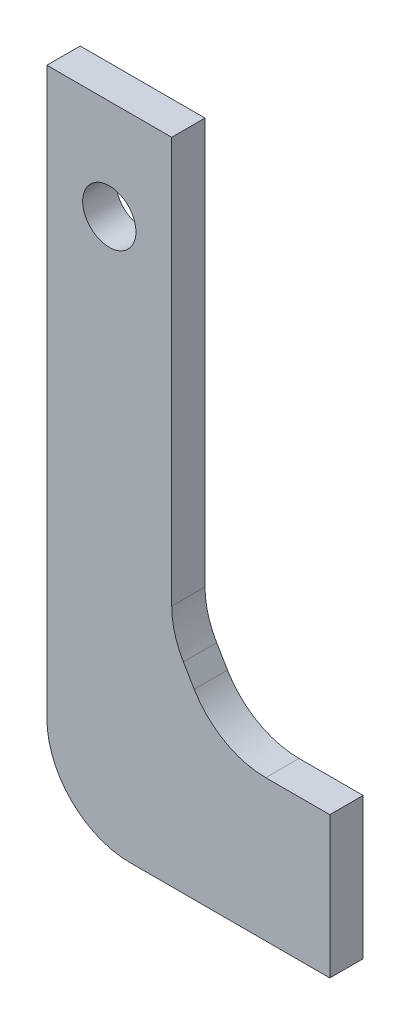
ISO-10303-21;
HEADER;
FILE_DESCRIPTION(('STEP AP214'),'2;1');
FILE_NAME('part.step','',(''),(''),'','','');
FILE_SCHEMA(('AUTOMOTIVE_DESIGN { 1 0 10303 214 1 1 1 1 }'));
ENDSEC;
DATA;
#1=APPLICATION_CONTEXT('core data for automotive mechanical design processes');
#2=APPLICATION_PROTOCOL_DEFINITION('international standard','automotive_design',2000,#1);
#3=PRODUCT_CONTEXT('',#1,'mechanical');
#4=PRODUCT('Part','Part','',(#3));
#5=PRODUCT_RELATED_PRODUCT_CATEGORY('part','',(#4));
#6=PRODUCT_DEFINITION_FORMATION('','',#4);
#7=PRODUCT_DEFINITION_CONTEXT('part definition',#1,'design');
#8=PRODUCT_DEFINITION('design','',#6,#7);
#9=PRODUCT_DEFINITION_SHAPE('','',#8);
#10=(LENGTH_UNIT() NAMED_UNIT(*) SI_UNIT(.MILLI.,.METRE.));
#11=(NAMED_UNIT(*) PLANE_ANGLE_UNIT() SI_UNIT($,.RADIAN.));
#12=(NAMED_UNIT(*) SI_UNIT($,.STERADIAN.) SOLID_ANGLE_UNIT());
#13=UNCERTAINTY_MEASURE_WITH_UNIT(LENGTH_MEASURE(1.E-05),#10,'distance_accuracy_value','');
#14=(GEOMETRIC_REPRESENTATION_CONTEXT(3) GLOBAL_UNCERTAINTY_ASSIGNED_CONTEXT((#13)) GLOBAL_UNIT_ASSIGNED_CONTEXT((#10,
#11,#12)) REPRESENTATION_CONTEXT('',''));
#15=CARTESIAN_POINT('',(0.,0.,0.));
#16=DIRECTION('',(0.,0.,1.));
#17=DIRECTION('',(1.,0.,0.));
#18=AXIS2_PLACEMENT_3D('',#15,#16,#17);
#19=CARTESIAN_POINT('',(-9.94142259414227,5.60827662797224,2.));
#20=DIRECTION('',(0.,0.,-1.));
#21=DIRECTION('',(-1.,0.,0.));
#22=AXIS2_PLACEMENT_3D('',#19,#20,#21);
#23=PLANE('',#22);
#24=DIRECTION('',(1.,0.,0.));
#25=VECTOR('',#24,1.);
#26=CARTESIAN_POINT('',(-22.4414225941423,30.0062761506276,2.));
#27=LINE('',#26,#25);
#28=CARTESIAN_POINT('',(-22.4414225941423,30.0062761506276,2.));
#29=VERTEX_POINT('',#28);
#30=CARTESIAN_POINT('',(-14.9414225941423,30.0062761506276,2.));
#31=VERTEX_POINT('',#30);
#32=EDGE_CURVE('E204',#29,#31,#27,.T.);
#33=ORIENTED_EDGE('',*,*,#32,.F.);
#34=DIRECTION('',(0.,-1.,0.));
#35=VECTOR('',#34,1.);
#36=CARTESIAN_POINT('',(-22.4414225941423,30.0062761506276,2.));
#37=LINE('',#36,#35);
#38=CARTESIAN_POINT('',(-22.4414225941423,-3.99372384937234,2.));
#39=VERTEX_POINT('',#38);
#40=EDGE_CURVE('E158',#29,#39,#37,.T.);
#41=ORIENTED_EDGE('',*,*,#40,.T.);
#42=CARTESIAN_POINT('',(-17.4414225941423,-3.99372384937238,2.));
#43=DIRECTION('',(0.,0.,1.));
#44=DIRECTION('',(1.,0.,0.));
#45=AXIS2_PLACEMENT_3D('',#42,#43,#44);
#46=CIRCLE('',#45,5.);
#47=CARTESIAN_POINT('',(-17.4414225941422,-8.99372384937238,2.));
#48=VERTEX_POINT('',#47);
#49=EDGE_CURVE('E151',#39,#48,#46,.T.);
#50=ORIENTED_EDGE('',*,*,#49,.T.);
#51=DIRECTION('',(1.,0.,0.));
#52=VECTOR('',#51,1.);
#53=CARTESIAN_POINT('',(-17.4414225941422,-8.99372384937238,2.));
#54=LINE('',#53,#52);
#55=CARTESIAN_POINT('',(-5.44142259414226,-8.99372384937238,2.));
#56=VERTEX_POINT('',#55);
#57=EDGE_CURVE('E156',#48,#56,#54,.T.);
#58=ORIENTED_EDGE('',*,*,#57,.T.);
#59=DIRECTION('',(0.,1.,0.));
#60=VECTOR('',#59,1.);
#61=CARTESIAN_POINT('',(-5.44142259414226,-8.99372384937238,2.));
#62=LINE('',#61,#60);
#63=CARTESIAN_POINT('',(-5.44142259414226,-0.493723849372379,2.));
#64=VERTEX_POINT('',#63);
#65=EDGE_CURVE('E173',#56,#64,#62,.T.);
#66=ORIENTED_EDGE('',*,*,#65,.T.);
#67=DIRECTION('',(1.,0.,0.));
#68=VECTOR('',#67,1.);
#69=CARTESIAN_POINT('',(-9.28759971678885,-0.493723849372379,2.));
#70=LINE('',#69,#68);
#71=CARTESIAN_POINT('',(-9.28759971678885,-0.49372384937238,2.));
#72=VERTEX_POINT('',#71);
#73=EDGE_CURVE('E175',#72,#64,#70,.T.);
#74=ORIENTED_EDGE('',*,*,#73,.F.);
#75=CARTESIAN_POINT('',(-9.28759971678885,4.50627615062762,2.));
#76=DIRECTION('',(0.,0.,1.));
#77=DIRECTION('',(1.,0.,0.));
#78=AXIS2_PLACEMENT_3D('',#75,#76,#77);
#79=CIRCLE('',#78,5.);
#80=CARTESIAN_POINT('',(-13.5877124021307,1.95499590468004,2.));
#81=VERTEX_POINT('',#80);
#82=EDGE_CURVE('E231',#81,#72,#79,.T.);
#83=ORIENTED_EDGE('',*,*,#82,.F.);
#84=DIRECTION('',(-0.510256049189516,0.860022537068364,0.));
#85=VECTOR('',#84,1.);
#86=CARTESIAN_POINT('',(-13.5877124021307,1.95499590468004,2.));
#87=LINE('',#86,#85);
#88=CARTESIAN_POINT('',(-14.2415352794841,3.05699638202466,2.));
#89=VERTEX_POINT('',#88);
#90=EDGE_CURVE('E238',#81,#89,#87,.T.);
#91=ORIENTED_EDGE('',*,*,#90,.T.);
#92=CARTESIAN_POINT('',(-9.94142259414227,5.60827662797224,2.));
#93=DIRECTION('',(0.,0.,-1.));
#94=DIRECTION('',(-1.,0.,0.));
#95=AXIS2_PLACEMENT_3D('',#92,#93,#94);
#96=CIRCLE('',#95,5.);
#97=CARTESIAN_POINT('',(-14.9414225941423,5.60827662797224,2.));
#98=VERTEX_POINT('',#97);
#99=EDGE_CURVE('E240',#89,#98,#96,.T.);
#100=ORIENTED_EDGE('',*,*,#99,.T.);
#101=DIRECTION('',(0.,-1.,0.));
#102=VECTOR('',#101,1.);
#103=CARTESIAN_POINT('',(-14.9414225941423,30.0062761506276,2.));
#104=LINE('',#103,#102);
#105=EDGE_CURVE('E244',#31,#98,#104,.T.);
#106=ORIENTED_EDGE('',*,*,#105,.F.);
#107=EDGE_LOOP('',(#33,#41,#50,#58,#66,#74,#83,#91,#100,#106));
#108=FACE_BOUND('',#107,.T.);
#109=CARTESIAN_POINT('',(-18.6914225941423,24.0062761506276,2.));
#110=DIRECTION('',(0.,0.,1.));
#111=DIRECTION('',(1.,0.,0.));
#112=AXIS2_PLACEMENT_3D('',#109,#110,#111);
#113=CIRCLE('',#112,1.6);
#114=CARTESIAN_POINT('',(-17.0914225941423,24.0062761506276,2.));
#115=VERTEX_POINT('',#114);
#116=EDGE_CURVE('E184',#115,#115,#113,.T.);
#117=ORIENTED_EDGE('',*,*,#116,.F.);
#118=EDGE_LOOP('',(#117));
#119=FACE_BOUND('',#118,.T.);
#120=ADVANCED_FACE('F69',(#108,#119),#23,.F.);
#121=CARTESIAN_POINT('',(-9.94142259414227,5.60827662797224,0.));
#122=DIRECTION('',(0.,0.,-1.));
#123=DIRECTION('',(-1.,0.,0.));
#124=AXIS2_PLACEMENT_3D('',#121,#122,#123);
#125=PLANE('',#124);
#126=DIRECTION('',(1.,0.,0.));
#127=VECTOR('',#126,1.);
#128=CARTESIAN_POINT('',(-22.4414225941423,30.0062761506276,0.));
#129=LINE('',#128,#127);
#130=CARTESIAN_POINT('',(-22.4414225941423,30.0062761506276,0.));
#131=VERTEX_POINT('',#130);
#132=CARTESIAN_POINT('',(-14.9414225941423,30.0062761506276,0.));
#133=VERTEX_POINT('',#132);
#134=EDGE_CURVE('E180',#131,#133,#129,.T.);
#135=ORIENTED_EDGE('',*,*,#134,.T.);
#136=DIRECTION('',(0.,-1.,0.));
#137=VECTOR('',#136,1.);
#138=CARTESIAN_POINT('',(-14.9414225941423,30.0062761506276,0.));
#139=LINE('',#138,#137);
#140=CARTESIAN_POINT('',(-14.9414225941423,5.60827662797224,0.));
#141=VERTEX_POINT('',#140);
#142=EDGE_CURVE('E183',#133,#141,#139,.T.);
#143=ORIENTED_EDGE('',*,*,#142,.T.);
#144=CARTESIAN_POINT('',(-9.94142259414227,5.60827662797224,0.));
#145=DIRECTION('',(0.,0.,-1.));
#146=DIRECTION('',(-1.,0.,0.));
#147=AXIS2_PLACEMENT_3D('',#144,#145,#146);
#148=CIRCLE('',#147,5.);
#149=CARTESIAN_POINT('',(-14.2415352794841,3.05699638202466,0.));
#150=VERTEX_POINT('',#149);
#151=EDGE_CURVE('E187',#150,#141,#148,.T.);
#152=ORIENTED_EDGE('',*,*,#151,.F.);
#153=DIRECTION('',(-0.510256049189516,0.860022537068364,0.));
#154=VECTOR('',#153,1.);
#155=CARTESIAN_POINT('',(-13.5877124021307,1.95499590468004,0.));
#156=LINE('',#155,#154);
#157=CARTESIAN_POINT('',(-13.5877124021307,1.95499590468004,0.));
#158=VERTEX_POINT('',#157);
#159=EDGE_CURVE('E190',#158,#150,#156,.T.);
#160=ORIENTED_EDGE('',*,*,#159,.F.);
#161=CARTESIAN_POINT('',(-9.28759971678885,4.50627615062762,0.));
#162=DIRECTION('',(0.,0.,1.));
#163=DIRECTION('',(1.,0.,0.));
#164=AXIS2_PLACEMENT_3D('',#161,#162,#163);
#165=CIRCLE('',#164,5.);
#166=CARTESIAN_POINT('',(-9.28759971678885,-0.49372384937238,0.));
#167=VERTEX_POINT('',#166);
#168=EDGE_CURVE('E192',#158,#167,#165,.T.);
#169=ORIENTED_EDGE('',*,*,#168,.T.);
#170=DIRECTION('',(1.,0.,0.));
#171=VECTOR('',#170,1.);
#172=CARTESIAN_POINT('',(-9.28759971678885,-0.493723849372379,0.));
#173=LINE('',#172,#171);
#174=CARTESIAN_POINT('',(-5.44142259414226,-0.493723849372379,0.));
#175=VERTEX_POINT('',#174);
#176=EDGE_CURVE('E195',#167,#175,#173,.T.);
#177=ORIENTED_EDGE('',*,*,#176,.T.);
#178=DIRECTION('',(0.,1.,0.));
#179=VECTOR('',#178,1.);
#180=CARTESIAN_POINT('',(-5.44142259414226,-8.99372384937238,0.));
#181=LINE('',#180,#179);
#182=CARTESIAN_POINT('',(-5.44142259414226,-8.99372384937238,0.));
#183=VERTEX_POINT('',#182);
#184=EDGE_CURVE('E198',#183,#175,#181,.T.);
#185=ORIENTED_EDGE('',*,*,#184,.F.);
#186=DIRECTION('',(1.,0.,0.));
#187=VECTOR('',#186,1.);
#188=CARTESIAN_POINT('',(-17.4414225941422,-8.99372384937238,0.));
#189=LINE('',#188,#187);
#190=CARTESIAN_POINT('',(-17.4414225941422,-8.99372384937238,0.));
#191=VERTEX_POINT('',#190);
#192=EDGE_CURVE('E201',#191,#183,#189,.T.);
#193=ORIENTED_EDGE('',*,*,#192,.F.);
#194=CARTESIAN_POINT('',(-17.4414225941423,-3.99372384937238,0.));
#195=DIRECTION('',(0.,0.,1.));
#196=DIRECTION('',(1.,0.,0.));
#197=AXIS2_PLACEMENT_3D('',#194,#195,#196);
#198=CIRCLE('',#197,5.);
#199=CARTESIAN_POINT('',(-22.4414225941423,-3.99372384937234,0.));
#200=VERTEX_POINT('',#199);
#201=EDGE_CURVE('E165',#200,#191,#198,.T.);
#202=ORIENTED_EDGE('',*,*,#201,.F.);
#203=DIRECTION('',(0.,-1.,0.));
#204=VECTOR('',#203,1.);
#205=CARTESIAN_POINT('',(-22.4414225941423,30.0062761506276,0.));
#206=LINE('',#205,#204);
#207=EDGE_CURVE('E121',#131,#200,#206,.T.);
#208=ORIENTED_EDGE('',*,*,#207,.F.);
#209=EDGE_LOOP('',(#135,#143,#152,#160,#169,#177,#185,#193,#202,#208));
#210=FACE_BOUND('',#209,.T.);
#211=CARTESIAN_POINT('',(-18.6914225941423,24.0062761506276,0.));
#212=DIRECTION('',(0.,0.,1.));
#213=DIRECTION('',(1.,0.,0.));
#214=AXIS2_PLACEMENT_3D('',#211,#212,#213);
#215=CIRCLE('',#214,1.6);
#216=CARTESIAN_POINT('',(-17.0914225941423,24.0062761506276,0.));
#217=VERTEX_POINT('',#216);
#218=EDGE_CURVE('E247',#217,#217,#215,.T.);
#219=ORIENTED_EDGE('',*,*,#218,.T.);
#220=EDGE_LOOP('',(#219));
#221=FACE_BOUND('',#220,.T.);
#222=ADVANCED_FACE('F221',(#210,#221),#125,.T.);
#223=CARTESIAN_POINT('',(-22.4414225941423,30.0062761506276,2.));
#224=DIRECTION('',(0.,1.,0.));
#225=DIRECTION('',(0.,0.,1.));
#226=AXIS2_PLACEMENT_3D('',#223,#224,#225);
#227=PLANE('',#226);
#228=ORIENTED_EDGE('',*,*,#134,.F.);
#229=DIRECTION('',(0.,0.,-1.));
#230=VECTOR('',#229,1.);
#231=CARTESIAN_POINT('',(-22.4414225941423,30.0062761506276,2.));
#232=LINE('',#231,#230);
#233=EDGE_CURVE('E12',#29,#131,#232,.T.);
#234=ORIENTED_EDGE('',*,*,#233,.F.);
#235=ORIENTED_EDGE('',*,*,#32,.T.);
#236=DIRECTION('',(0.,0.,-1.));
#237=VECTOR('',#236,1.);
#238=CARTESIAN_POINT('',(-14.9414225941423,30.0062761506276,2.));
#239=LINE('',#238,#237);
#240=EDGE_CURVE('E73',#31,#133,#239,.T.);
#241=ORIENTED_EDGE('',*,*,#240,.T.);
#242=EDGE_LOOP('',(#228,#234,#235,#241));
#243=FACE_BOUND('',#242,.T.);
#244=ADVANCED_FACE('F71',(#243),#227,.T.);
#245=CARTESIAN_POINT('',(-22.4414225941423,30.0062761506276,2.));
#246=DIRECTION('',(1.,0.,0.));
#247=DIRECTION('',(0.,0.,-1.));
#248=AXIS2_PLACEMENT_3D('',#245,#246,#247);
#249=PLANE('',#248);
#250=ORIENTED_EDGE('',*,*,#207,.T.);
#251=DIRECTION('',(0.,0.,-1.));
#252=VECTOR('',#251,1.);
#253=CARTESIAN_POINT('',(-22.4414225941423,-3.99372384937234,2.));
#254=LINE('',#253,#252);
#255=EDGE_CURVE('E79',#39,#200,#254,.T.);
#256=ORIENTED_EDGE('',*,*,#255,.F.);
#257=ORIENTED_EDGE('',*,*,#40,.F.);
#258=ORIENTED_EDGE('',*,*,#233,.T.);
#259=EDGE_LOOP('',(#250,#256,#257,#258));
#260=FACE_BOUND('',#259,.T.);
#261=ADVANCED_FACE('F263',(#260),#249,.F.);
#262=CARTESIAN_POINT('',(-17.4414225941423,-3.99372384937238,2.));
#263=DIRECTION('',(0.,0.,-1.));
#264=DIRECTION('',(-1.,0.,0.));
#265=AXIS2_PLACEMENT_3D('',#262,#263,#264);
#266=CYLINDRICAL_SURFACE('',#265,5.);
#267=ORIENTED_EDGE('',*,*,#201,.T.);
#268=DIRECTION('',(0.,0.,-1.));
#269=VECTOR('',#268,1.);
#270=CARTESIAN_POINT('',(-17.4414225941422,-8.99372384937238,2.));
#271=LINE('',#270,#269);
#272=EDGE_CURVE('E162',#48,#191,#271,.T.);
#273=ORIENTED_EDGE('',*,*,#272,.F.);
#274=ORIENTED_EDGE('',*,*,#49,.F.);
#275=ORIENTED_EDGE('',*,*,#255,.T.);
#276=EDGE_LOOP('',(#267,#273,#274,#275));
#277=FACE_BOUND('',#276,.T.);
#278=ADVANCED_FACE('F163',(#277),#266,.T.);
#279=CARTESIAN_POINT('',(-17.4414225941422,-8.99372384937238,2.));
#280=DIRECTION('',(0.,1.,0.));
#281=DIRECTION('',(-1.,0.,0.));
#282=AXIS2_PLACEMENT_3D('',#279,#280,#281);
#283=PLANE('',#282);
#284=ORIENTED_EDGE('',*,*,#192,.T.);
#285=DIRECTION('',(0.,0.,-1.));
#286=VECTOR('',#285,1.);
#287=CARTESIAN_POINT('',(-5.44142259414226,-8.99372384937238,2.));
#288=LINE('',#287,#286);
#289=EDGE_CURVE('E168',#56,#183,#288,.T.);
#290=ORIENTED_EDGE('',*,*,#289,.F.);
#291=ORIENTED_EDGE('',*,*,#57,.F.);
#292=ORIENTED_EDGE('',*,*,#272,.T.);
#293=EDGE_LOOP('',(#284,#290,#291,#292));
#294=FACE_BOUND('',#293,.T.);
#295=ADVANCED_FACE('F170',(#294),#283,.F.);
#296=CARTESIAN_POINT('',(-5.44142259414226,-8.99372384937238,2.));
#297=DIRECTION('',(-1.,0.,0.));
#298=DIRECTION('',(0.,-1.,0.));
#299=AXIS2_PLACEMENT_3D('',#296,#297,#298);
#300=PLANE('',#299);
#301=ORIENTED_EDGE('',*,*,#184,.T.);
#302=DIRECTION('',(0.,0.,-1.));
#303=VECTOR('',#302,1.);
#304=CARTESIAN_POINT('',(-5.44142259414226,-0.493723849372379,2.));
#305=LINE('',#304,#303);
#306=EDGE_CURVE('E208',#64,#175,#305,.T.);
#307=ORIENTED_EDGE('',*,*,#306,.F.);
#308=ORIENTED_EDGE('',*,*,#65,.F.);
#309=ORIENTED_EDGE('',*,*,#289,.T.);
#310=EDGE_LOOP('',(#301,#307,#308,#309));
#311=FACE_BOUND('',#310,.T.);
#312=ADVANCED_FACE('F225',(#311),#300,.F.);
#313=CARTESIAN_POINT('',(-9.28759971678885,-0.493723849372379,2.));
#314=DIRECTION('',(0.,1.,0.));
#315=DIRECTION('',(0.,0.,1.));
#316=AXIS2_PLACEMENT_3D('',#313,#314,#315);
#317=PLANE('',#316);
#318=ORIENTED_EDGE('',*,*,#176,.F.);
#319=DIRECTION('',(0.,0.,-1.));
#320=VECTOR('',#319,1.);
#321=CARTESIAN_POINT('',(-9.28759971678885,-0.49372384937238,2.));
#322=LINE('',#321,#320);
#323=EDGE_CURVE('E210',#72,#167,#322,.T.);
#324=ORIENTED_EDGE('',*,*,#323,.F.);
#325=ORIENTED_EDGE('',*,*,#73,.T.);
#326=ORIENTED_EDGE('',*,*,#306,.T.);
#327=EDGE_LOOP('',(#318,#324,#325,#326));
#328=FACE_BOUND('',#327,.T.);
#329=ADVANCED_FACE('F272',(#328),#317,.T.);
#330=CARTESIAN_POINT('',(-9.28759971678885,4.50627615062762,2.));
#331=DIRECTION('',(0.,0.,-1.));
#332=DIRECTION('',(-1.,0.,0.));
#333=AXIS2_PLACEMENT_3D('',#330,#331,#332);
#334=CYLINDRICAL_SURFACE('',#333,5.);
#335=ORIENTED_EDGE('',*,*,#168,.F.);
#336=DIRECTION('',(0.,0.,-1.));
#337=VECTOR('',#336,1.);
#338=CARTESIAN_POINT('',(-13.5877124021307,1.95499590468004,2.));
#339=LINE('',#338,#337);
#340=EDGE_CURVE('E212',#81,#158,#339,.T.);
#341=ORIENTED_EDGE('',*,*,#340,.F.);
#342=ORIENTED_EDGE('',*,*,#82,.T.);
#343=ORIENTED_EDGE('',*,*,#323,.T.);
#344=EDGE_LOOP('',(#335,#341,#342,#343));
#345=FACE_BOUND('',#344,.T.);
#346=ADVANCED_FACE('F235',(#345),#334,.F.);
#347=CARTESIAN_POINT('',(-13.5877124021307,1.95499590468004,2.));
#348=DIRECTION('',(-0.860022537068365,-0.510256049189516,0.));
#349=DIRECTION('',(0.510256049189516,-0.860022537068365,0.));
#350=AXIS2_PLACEMENT_3D('',#347,#348,#349);
#351=PLANE('',#350);
#352=ORIENTED_EDGE('',*,*,#159,.T.);
#353=DIRECTION('',(0.,0.,-1.));
#354=VECTOR('',#353,1.);
#355=CARTESIAN_POINT('',(-14.2415352794841,3.05699638202466,2.));
#356=LINE('',#355,#354);
#357=EDGE_CURVE('E214',#89,#150,#356,.T.);
#358=ORIENTED_EDGE('',*,*,#357,.F.);
#359=ORIENTED_EDGE('',*,*,#90,.F.);
#360=ORIENTED_EDGE('',*,*,#340,.T.);
#361=EDGE_LOOP('',(#352,#358,#359,#360));
#362=FACE_BOUND('',#361,.T.);
#363=ADVANCED_FACE('F277',(#362),#351,.F.);
#364=CARTESIAN_POINT('',(-9.94142259414227,5.60827662797224,2.));
#365=DIRECTION('',(0.,0.,-1.));
#366=DIRECTION('',(-1.,0.,0.));
#367=AXIS2_PLACEMENT_3D('',#364,#365,#366);
#368=CYLINDRICAL_SURFACE('',#367,5.);
#369=ORIENTED_EDGE('',*,*,#151,.T.);
#370=DIRECTION('',(0.,0.,-1.));
#371=VECTOR('',#370,1.);
#372=CARTESIAN_POINT('',(-14.9414225941423,5.60827662797224,2.));
#373=LINE('',#372,#371);
#374=EDGE_CURVE('E216',#98,#141,#373,.T.);
#375=ORIENTED_EDGE('',*,*,#374,.F.);
#376=ORIENTED_EDGE('',*,*,#99,.F.);
#377=ORIENTED_EDGE('',*,*,#357,.T.);
#378=EDGE_LOOP('',(#369,#375,#376,#377));
#379=FACE_BOUND('',#378,.T.);
#380=ADVANCED_FACE('F280',(#379),#368,.F.);
#381=CARTESIAN_POINT('',(-14.9414225941423,30.0062761506276,2.));
#382=DIRECTION('',(1.,0.,0.));
#383=DIRECTION('',(0.,0.,-1.));
#384=AXIS2_PLACEMENT_3D('',#381,#382,#383);
#385=PLANE('',#384);
#386=ORIENTED_EDGE('',*,*,#142,.F.);
#387=ORIENTED_EDGE('',*,*,#240,.F.);
#388=ORIENTED_EDGE('',*,*,#105,.T.);
#389=ORIENTED_EDGE('',*,*,#374,.T.);
#390=EDGE_LOOP('',(#386,#387,#388,#389));
#391=FACE_BOUND('',#390,.T.);
#392=ADVANCED_FACE('F218',(#391),#385,.T.);
#393=CARTESIAN_POINT('',(-18.6914225941423,24.0062761506276,2.));
#394=DIRECTION('',(0.,0.,-1.));
#395=DIRECTION('',(-1.,0.,0.));
#396=AXIS2_PLACEMENT_3D('',#393,#394,#395);
#397=CYLINDRICAL_SURFACE('',#396,1.6);
#398=ORIENTED_EDGE('',*,*,#116,.T.);
#399=EDGE_LOOP('',(#398));
#400=FACE_BOUND('',#399,.T.);
#401=ORIENTED_EDGE('',*,*,#218,.F.);
#402=EDGE_LOOP('',(#401));
#403=FACE_BOUND('',#402,.T.);
#404=ADVANCED_FACE('F253',(#400,#403),#397,.F.);
#405=CLOSED_SHELL('',(#120,#222,#244,#261,#278,#295,#312,#329,#346,#363,#380,#392,#404));
#406=MANIFOLD_SOLID_BREP('B2',#405);
#407=ADVANCED_BREP_SHAPE_REPRESENTATION('',(#18,#406),#14);
#408=SHAPE_DEFINITION_REPRESENTATION(#9,#407);
ENDSEC;
END-ISO-10303-21;
